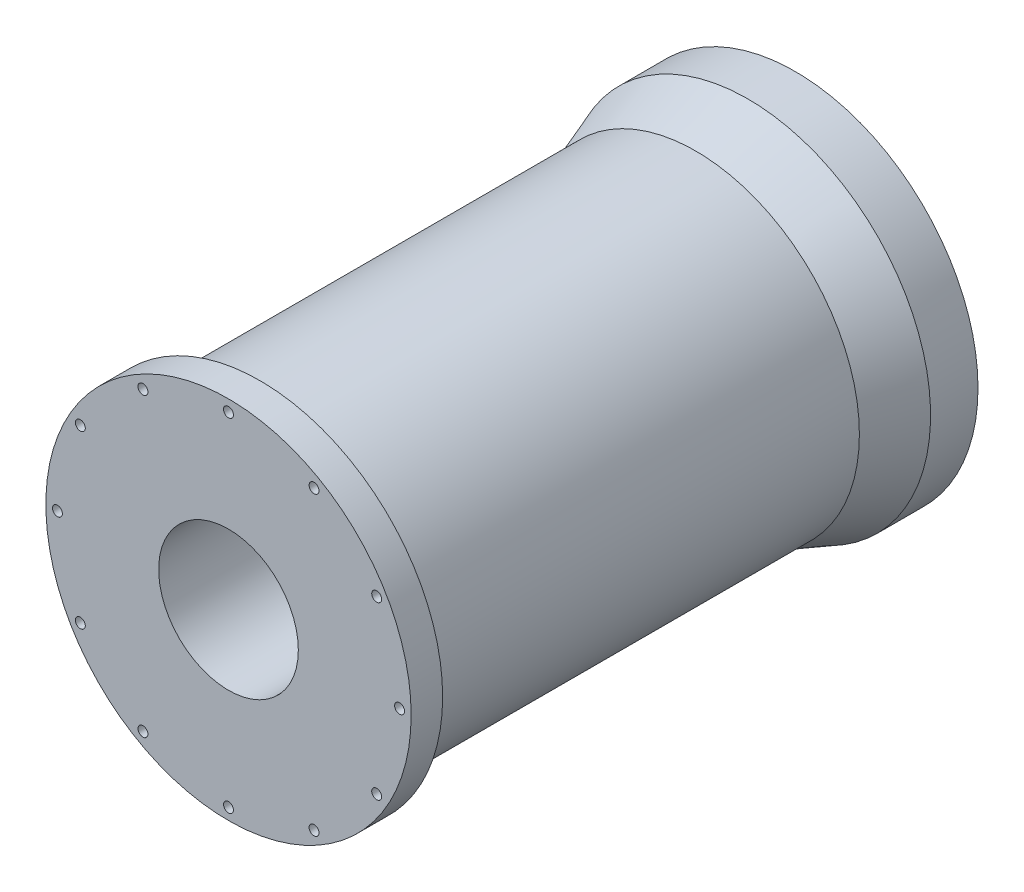
ISO-10303-21;
HEADER;
FILE_DESCRIPTION(('STEP AP214'),'2;1');
FILE_NAME('part.step','',(''),(''),'','','');
FILE_SCHEMA(('AUTOMOTIVE_DESIGN { 1 0 10303 214 1 1 1 1 }'));
ENDSEC;
DATA;
#1=APPLICATION_CONTEXT('core data for automotive mechanical design processes');
#2=APPLICATION_PROTOCOL_DEFINITION('international standard','automotive_design',2000,#1);
#3=PRODUCT_CONTEXT('',#1,'mechanical');
#4=PRODUCT('Part','Part','',(#3));
#5=PRODUCT_RELATED_PRODUCT_CATEGORY('part','',(#4));
#6=PRODUCT_DEFINITION_FORMATION('','',#4);
#7=PRODUCT_DEFINITION_CONTEXT('part definition',#1,'design');
#8=PRODUCT_DEFINITION('design','',#6,#7);
#9=PRODUCT_DEFINITION_SHAPE('','',#8);
#10=(LENGTH_UNIT() NAMED_UNIT(*) SI_UNIT(.MILLI.,.METRE.));
#11=(NAMED_UNIT(*) PLANE_ANGLE_UNIT() SI_UNIT($,.RADIAN.));
#12=(NAMED_UNIT(*) SI_UNIT($,.STERADIAN.) SOLID_ANGLE_UNIT());
#13=UNCERTAINTY_MEASURE_WITH_UNIT(LENGTH_MEASURE(1.E-05),#10,'distance_accuracy_value','');
#14=(GEOMETRIC_REPRESENTATION_CONTEXT(3) GLOBAL_UNCERTAINTY_ASSIGNED_CONTEXT((#13)) GLOBAL_UNIT_ASSIGNED_CONTEXT((#10,
#11,#12)) REPRESENTATION_CONTEXT('',''));
#15=CARTESIAN_POINT('',(0.,0.,0.));
#16=DIRECTION('',(0.,0.,1.));
#17=DIRECTION('',(1.,0.,0.));
#18=AXIS2_PLACEMENT_3D('',#15,#16,#17);
#19=CARTESIAN_POINT('',(0.,0.,12.7));
#20=DIRECTION('',(0.,0.,-1.));
#21=DIRECTION('',(-1.,0.,0.));
#22=AXIS2_PLACEMENT_3D('',#19,#20,#21);
#23=CYLINDRICAL_SURFACE('',#22,73.66);
#24=CARTESIAN_POINT('',(0.,0.,19.1290971615244));
#25=DIRECTION('',(0.,0.,-1.));
#26=DIRECTION('',(-1.,0.,0.));
#27=AXIS2_PLACEMENT_3D('',#24,#25,#26);
#28=CIRCLE('',#27,73.66);
#29=CARTESIAN_POINT('',(-73.66,0.,19.1290971615244));
#30=VERTEX_POINT('',#29);
#31=EDGE_CURVE('E10',#30,#30,#28,.T.);
#32=ORIENTED_EDGE('',*,*,#31,.T.);
#33=EDGE_LOOP('',(#32));
#34=FACE_BOUND('',#33,.T.);
#35=CARTESIAN_POINT('',(0.,0.,0.));
#36=DIRECTION('',(0.,0.,1.));
#37=DIRECTION('',(1.,0.,0.));
#38=AXIS2_PLACEMENT_3D('',#35,#36,#37);
#39=CIRCLE('',#38,73.66);
#40=CARTESIAN_POINT('',(73.66,0.,0.));
#41=VERTEX_POINT('',#40);
#42=EDGE_CURVE('E53',#41,#41,#39,.T.);
#43=ORIENTED_EDGE('',*,*,#42,.T.);
#44=EDGE_LOOP('',(#43));
#45=FACE_BOUND('',#44,.T.);
#46=ADVANCED_FACE('F39',(#34,#45),#23,.T.);
#47=CARTESIAN_POINT('',(0.,0.,0.));
#48=DIRECTION('',(0.,0.,1.));
#49=DIRECTION('',(1.,0.,0.));
#50=AXIS2_PLACEMENT_3D('',#47,#48,#49);
#51=PLANE('',#50);
#52=ORIENTED_EDGE('',*,*,#42,.F.);
#53=EDGE_LOOP('',(#52));
#54=FACE_BOUND('',#53,.T.);
#55=ADVANCED_FACE('F235',(#54),#51,.F.);
#56=CARTESIAN_POINT('',(0.,0.,215.9));
#57=DIRECTION('',(0.,0.,-1.));
#58=DIRECTION('',(-1.,0.,0.));
#59=AXIS2_PLACEMENT_3D('',#56,#57,#58);
#60=CYLINDRICAL_SURFACE('',#59,66.);
#61=CARTESIAN_POINT('',(0.,0.,40.1747741945471));
#62=DIRECTION('',(0.,0.,1.));
#63=DIRECTION('',(1.,0.,0.));
#64=AXIS2_PLACEMENT_3D('',#61,#62,#63);
#65=CIRCLE('',#64,66.);
#66=CARTESIAN_POINT('',(66.,0.,40.1747741945471));
#67=VERTEX_POINT('',#66);
#68=EDGE_CURVE('E48',#67,#67,#65,.T.);
#69=ORIENTED_EDGE('',*,*,#68,.T.);
#70=EDGE_LOOP('',(#69));
#71=FACE_BOUND('',#70,.T.);
#72=CARTESIAN_POINT('',(0.,0.,215.9));
#73=DIRECTION('',(0.,0.,1.));
#74=DIRECTION('',(1.,0.,0.));
#75=AXIS2_PLACEMENT_3D('',#72,#73,#74);
#76=CIRCLE('',#75,66.);
#77=CARTESIAN_POINT('',(66.,0.,215.9));
#78=VERTEX_POINT('',#77);
#79=EDGE_CURVE('E58',#78,#78,#76,.T.);
#80=ORIENTED_EDGE('',*,*,#79,.F.);
#81=EDGE_LOOP('',(#80));
#82=FACE_BOUND('',#81,.T.);
#83=ADVANCED_FACE('F219',(#71,#82),#60,.T.);
#84=CARTESIAN_POINT('',(0.,0.,228.6));
#85=DIRECTION('',(0.,0.,-1.));
#86=DIRECTION('',(-1.,0.,0.));
#87=AXIS2_PLACEMENT_3D('',#84,#85,#86);
#88=CYLINDRICAL_SURFACE('',#87,73.66);
#89=CARTESIAN_POINT('',(0.,0.,228.6));
#90=DIRECTION('',(0.,0.,1.));
#91=DIRECTION('',(1.,0.,0.));
#92=AXIS2_PLACEMENT_3D('',#89,#90,#91);
#93=CIRCLE('',#92,73.66);
#94=CARTESIAN_POINT('',(73.66,0.,228.6));
#95=VERTEX_POINT('',#94);
#96=EDGE_CURVE('E64',#95,#95,#93,.T.);
#97=ORIENTED_EDGE('',*,*,#96,.F.);
#98=EDGE_LOOP('',(#97));
#99=FACE_BOUND('',#98,.T.);
#100=CARTESIAN_POINT('',(0.,0.,215.9));
#101=DIRECTION('',(0.,0.,1.));
#102=DIRECTION('',(1.,0.,0.));
#103=AXIS2_PLACEMENT_3D('',#100,#101,#102);
#104=CIRCLE('',#103,73.66);
#105=CARTESIAN_POINT('',(73.66,0.,215.9));
#106=VERTEX_POINT('',#105);
#107=EDGE_CURVE('E65',#106,#106,#104,.T.);
#108=ORIENTED_EDGE('',*,*,#107,.T.);
#109=EDGE_LOOP('',(#108));
#110=FACE_BOUND('',#109,.T.);
#111=ADVANCED_FACE('F189',(#99,#110),#88,.T.);
#112=CARTESIAN_POINT('',(0.,0.,228.6));
#113=DIRECTION('',(0.,0.,1.));
#114=DIRECTION('',(1.,0.,0.));
#115=AXIS2_PLACEMENT_3D('',#112,#113,#114);
#116=PLANE('',#115);
#117=CARTESIAN_POINT('',(0.,0.,228.6));
#118=DIRECTION('',(0.,0.,1.));
#119=DIRECTION('',(1.,0.,0.));
#120=AXIS2_PLACEMENT_3D('',#117,#118,#119);
#121=CIRCLE('',#120,28.1625529);
#122=CARTESIAN_POINT('',(28.1625529,0.,228.6));
#123=VERTEX_POINT('',#122);
#124=EDGE_CURVE('E169',#123,#123,#121,.T.);
#125=ORIENTED_EDGE('',*,*,#124,.F.);
#126=EDGE_LOOP('',(#125));
#127=FACE_BOUND('',#126,.T.);
#128=CARTESIAN_POINT('',(0.,69.,228.6));
#129=DIRECTION('',(0.,0.,1.));
#130=DIRECTION('',(1.,0.,0.));
#131=AXIS2_PLACEMENT_3D('',#128,#129,#130);
#132=CIRCLE('',#131,2.);
#133=CARTESIAN_POINT('',(2.,69.,228.6));
#134=VERTEX_POINT('',#133);
#135=EDGE_CURVE('E106',#134,#134,#132,.T.);
#136=ORIENTED_EDGE('',*,*,#135,.F.);
#137=EDGE_LOOP('',(#136));
#138=FACE_BOUND('',#137,.T.);
#139=CARTESIAN_POINT('',(-34.4999999999992,59.7557528611233,228.6));
#140=DIRECTION('',(0.,0.,1.));
#141=DIRECTION('',(1.,0.,0.));
#142=AXIS2_PLACEMENT_3D('',#139,#140,#141);
#143=CIRCLE('',#142,2.);
#144=CARTESIAN_POINT('',(-32.4999999999992,59.7557528611233,228.6));
#145=VERTEX_POINT('',#144);
#146=EDGE_CURVE('E139',#145,#145,#143,.T.);
#147=ORIENTED_EDGE('',*,*,#146,.F.);
#148=EDGE_LOOP('',(#147));
#149=FACE_BOUND('',#148,.T.);
#150=CARTESIAN_POINT('',(-59.7557528611233,34.4999999999948,228.6));
#151=DIRECTION('',(0.,0.,1.));
#152=DIRECTION('',(1.,0.,0.));
#153=AXIS2_PLACEMENT_3D('',#150,#151,#152);
#154=CIRCLE('',#153,2.);
#155=CARTESIAN_POINT('',(-57.7557528611233,34.4999999999948,228.6));
#156=VERTEX_POINT('',#155);
#157=EDGE_CURVE('E148',#156,#156,#154,.T.);
#158=ORIENTED_EDGE('',*,*,#157,.F.);
#159=EDGE_LOOP('',(#158));
#160=FACE_BOUND('',#159,.T.);
#161=CARTESIAN_POINT('',(-68.9999999999941,-5.93746887267724E-12,228.6));
#162=DIRECTION('',(0.,0.,1.));
#163=DIRECTION('',(1.,0.,0.));
#164=AXIS2_PLACEMENT_3D('',#161,#162,#163);
#165=CIRCLE('',#164,2.);
#166=CARTESIAN_POINT('',(-66.9999999999941,-5.93746887267724E-12,228.6));
#167=VERTEX_POINT('',#166);
#168=EDGE_CURVE('E156',#167,#167,#165,.T.);
#169=ORIENTED_EDGE('',*,*,#168,.F.);
#170=EDGE_LOOP('',(#169));
#171=FACE_BOUND('',#170,.T.);
#172=CARTESIAN_POINT('',(34.5000000000008,59.7557528611292,228.6));
#173=DIRECTION('',(0.,0.,1.));
#174=DIRECTION('',(1.,0.,0.));
#175=AXIS2_PLACEMENT_3D('',#172,#173,#174);
#176=CIRCLE('',#175,2.);
#177=CARTESIAN_POINT('',(36.5000000000008,59.7557528611292,228.6));
#178=VERTEX_POINT('',#177);
#179=EDGE_CURVE('E98',#178,#178,#176,.T.);
#180=ORIENTED_EDGE('',*,*,#179,.F.);
#181=EDGE_LOOP('',(#180));
#182=FACE_BOUND('',#181,.T.);
#183=CARTESIAN_POINT('',(59.7557528611292,34.5000000000051,228.6));
#184=DIRECTION('',(0.,0.,1.));
#185=DIRECTION('',(1.,0.,0.));
#186=AXIS2_PLACEMENT_3D('',#183,#184,#185);
#187=CIRCLE('',#186,2.);
#188=CARTESIAN_POINT('',(61.7557528611292,34.5000000000051,228.6));
#189=VERTEX_POINT('',#188);
#190=EDGE_CURVE('E90',#189,#189,#187,.T.);
#191=ORIENTED_EDGE('',*,*,#190,.F.);
#192=EDGE_LOOP('',(#191));
#193=FACE_BOUND('',#192,.T.);
#194=CARTESIAN_POINT('',(69.0000000000059,5.92901880976312E-12,228.6));
#195=DIRECTION('',(0.,0.,1.));
#196=DIRECTION('',(1.,0.,0.));
#197=AXIS2_PLACEMENT_3D('',#194,#195,#196);
#198=CIRCLE('',#197,2.);
#199=CARTESIAN_POINT('',(71.0000000000059,5.92901880976312E-12,228.6));
#200=VERTEX_POINT('',#199);
#201=EDGE_CURVE('E82',#200,#200,#198,.T.);
#202=ORIENTED_EDGE('',*,*,#201,.F.);
#203=EDGE_LOOP('',(#202));
#204=FACE_BOUND('',#203,.T.);
#205=CARTESIAN_POINT('',(59.7557528611352,-34.4999999999949,228.6));
#206=DIRECTION('',(0.,0.,1.));
#207=DIRECTION('',(1.,0.,0.));
#208=AXIS2_PLACEMENT_3D('',#205,#206,#207);
#209=CIRCLE('',#208,2.);
#210=CARTESIAN_POINT('',(61.7557528611352,-34.4999999999949,228.6));
#211=VERTEX_POINT('',#210);
#212=EDGE_CURVE('E73',#211,#211,#209,.T.);
#213=ORIENTED_EDGE('',*,*,#212,.F.);
#214=EDGE_LOOP('',(#213));
#215=FACE_BOUND('',#214,.T.);
#216=CARTESIAN_POINT('',(34.5000000000111,-59.7557528611233,228.6));
#217=DIRECTION('',(0.,0.,1.));
#218=DIRECTION('',(1.,0.,0.));
#219=AXIS2_PLACEMENT_3D('',#216,#217,#218);
#220=CIRCLE('',#219,2.);
#221=CARTESIAN_POINT('',(36.5000000000111,-59.7557528611233,228.6));
#222=VERTEX_POINT('',#221);
#223=EDGE_CURVE('E132',#222,#222,#220,.T.);
#224=ORIENTED_EDGE('',*,*,#223,.F.);
#225=EDGE_LOOP('',(#224));
#226=FACE_BOUND('',#225,.T.);
#227=CARTESIAN_POINT('',(1.18580376195262E-11,-69.,228.6));
#228=DIRECTION('',(0.,0.,1.));
#229=DIRECTION('',(1.,0.,0.));
#230=AXIS2_PLACEMENT_3D('',#227,#228,#229);
#231=CIRCLE('',#230,2.);
#232=CARTESIAN_POINT('',(2.00000000001186,-69.,228.6));
#233=VERTEX_POINT('',#232);
#234=EDGE_CURVE('E124',#233,#233,#231,.T.);
#235=ORIENTED_EDGE('',*,*,#234,.F.);
#236=EDGE_LOOP('',(#235));
#237=FACE_BOUND('',#236,.T.);
#238=CARTESIAN_POINT('',(-34.4999999999889,-59.7557528611292,228.6));
#239=DIRECTION('',(0.,0.,1.));
#240=DIRECTION('',(1.,0.,0.));
#241=AXIS2_PLACEMENT_3D('',#238,#239,#240);
#242=CIRCLE('',#241,2.);
#243=CARTESIAN_POINT('',(-32.4999999999889,-59.7557528611292,228.6));
#244=VERTEX_POINT('',#243);
#245=EDGE_CURVE('E116',#244,#244,#242,.T.);
#246=ORIENTED_EDGE('',*,*,#245,.F.);
#247=EDGE_LOOP('',(#246));
#248=FACE_BOUND('',#247,.T.);
#249=CARTESIAN_POINT('',(-59.7557528611174,-34.5000000000052,228.6));
#250=DIRECTION('',(0.,0.,1.));
#251=DIRECTION('',(1.,0.,0.));
#252=AXIS2_PLACEMENT_3D('',#249,#250,#251);
#253=CIRCLE('',#252,2.);
#254=CARTESIAN_POINT('',(-57.7557528611174,-34.5000000000052,228.6));
#255=VERTEX_POINT('',#254);
#256=EDGE_CURVE('E107',#255,#255,#253,.T.);
#257=ORIENTED_EDGE('',*,*,#256,.F.);
#258=EDGE_LOOP('',(#257));
#259=FACE_BOUND('',#258,.T.);
#260=ORIENTED_EDGE('',*,*,#96,.T.);
#261=EDGE_LOOP('',(#260));
#262=FACE_BOUND('',#261,.T.);
#263=ADVANCED_FACE('F185',(#127,#138,#149,#160,#171,#182,#193,#204,#215,#226,#237,#248,#259,
#262),#116,.T.);
#264=CARTESIAN_POINT('',(0.,0.,215.9));
#265=DIRECTION('',(0.,0.,1.));
#266=DIRECTION('',(1.,0.,0.));
#267=AXIS2_PLACEMENT_3D('',#264,#265,#266);
#268=PLANE('',#267);
#269=CARTESIAN_POINT('',(0.,69.,215.9));
#270=DIRECTION('',(0.,0.,1.));
#271=DIRECTION('',(1.,0.,0.));
#272=AXIS2_PLACEMENT_3D('',#269,#270,#271);
#273=CIRCLE('',#272,2.);
#274=CARTESIAN_POINT('',(2.,69.,215.9));
#275=VERTEX_POINT('',#274);
#276=EDGE_CURVE('E69',#275,#275,#273,.T.);
#277=ORIENTED_EDGE('',*,*,#276,.T.);
#278=EDGE_LOOP('',(#277));
#279=FACE_BOUND('',#278,.T.);
#280=CARTESIAN_POINT('',(-34.4999999999992,59.7557528611233,215.9));
#281=DIRECTION('',(0.,0.,1.));
#282=DIRECTION('',(1.,0.,0.));
#283=AXIS2_PLACEMENT_3D('',#280,#281,#282);
#284=CIRCLE('',#283,2.);
#285=CARTESIAN_POINT('',(-32.4999999999992,59.7557528611233,215.9));
#286=VERTEX_POINT('',#285);
#287=EDGE_CURVE('E143',#286,#286,#284,.T.);
#288=ORIENTED_EDGE('',*,*,#287,.T.);
#289=EDGE_LOOP('',(#288));
#290=FACE_BOUND('',#289,.T.);
#291=CARTESIAN_POINT('',(-59.7557528611233,34.4999999999948,215.9));
#292=DIRECTION('',(0.,0.,1.));
#293=DIRECTION('',(1.,0.,0.));
#294=AXIS2_PLACEMENT_3D('',#291,#292,#293);
#295=CIRCLE('',#294,2.);
#296=CARTESIAN_POINT('',(-57.7557528611233,34.4999999999948,215.9));
#297=VERTEX_POINT('',#296);
#298=EDGE_CURVE('E152',#297,#297,#295,.T.);
#299=ORIENTED_EDGE('',*,*,#298,.T.);
#300=EDGE_LOOP('',(#299));
#301=FACE_BOUND('',#300,.T.);
#302=CARTESIAN_POINT('',(-68.9999999999941,-5.93746887267724E-12,215.9));
#303=DIRECTION('',(0.,0.,1.));
#304=DIRECTION('',(1.,0.,0.));
#305=AXIS2_PLACEMENT_3D('',#302,#303,#304);
#306=CIRCLE('',#305,2.);
#307=CARTESIAN_POINT('',(-66.9999999999941,-5.93746887267724E-12,215.9));
#308=VERTEX_POINT('',#307);
#309=EDGE_CURVE('E112',#308,#308,#306,.T.);
#310=ORIENTED_EDGE('',*,*,#309,.T.);
#311=EDGE_LOOP('',(#310));
#312=FACE_BOUND('',#311,.T.);
#313=CARTESIAN_POINT('',(34.5000000000008,59.7557528611292,215.9));
#314=DIRECTION('',(0.,0.,1.));
#315=DIRECTION('',(1.,0.,0.));
#316=AXIS2_PLACEMENT_3D('',#313,#314,#315);
#317=CIRCLE('',#316,2.);
#318=CARTESIAN_POINT('',(36.5000000000008,59.7557528611292,215.9));
#319=VERTEX_POINT('',#318);
#320=EDGE_CURVE('E102',#319,#319,#317,.T.);
#321=ORIENTED_EDGE('',*,*,#320,.T.);
#322=EDGE_LOOP('',(#321));
#323=FACE_BOUND('',#322,.T.);
#324=CARTESIAN_POINT('',(59.7557528611292,34.5000000000051,215.9));
#325=DIRECTION('',(0.,0.,1.));
#326=DIRECTION('',(1.,0.,0.));
#327=AXIS2_PLACEMENT_3D('',#324,#325,#326);
#328=CIRCLE('',#327,2.);
#329=CARTESIAN_POINT('',(61.7557528611292,34.5000000000051,215.9));
#330=VERTEX_POINT('',#329);
#331=EDGE_CURVE('E94',#330,#330,#328,.T.);
#332=ORIENTED_EDGE('',*,*,#331,.T.);
#333=EDGE_LOOP('',(#332));
#334=FACE_BOUND('',#333,.T.);
#335=CARTESIAN_POINT('',(69.0000000000059,5.92901880976312E-12,215.9));
#336=DIRECTION('',(0.,0.,1.));
#337=DIRECTION('',(1.,0.,0.));
#338=AXIS2_PLACEMENT_3D('',#335,#336,#337);
#339=CIRCLE('',#338,2.);
#340=CARTESIAN_POINT('',(71.0000000000059,5.92901880976312E-12,215.9));
#341=VERTEX_POINT('',#340);
#342=EDGE_CURVE('E86',#341,#341,#339,.T.);
#343=ORIENTED_EDGE('',*,*,#342,.T.);
#344=EDGE_LOOP('',(#343));
#345=FACE_BOUND('',#344,.T.);
#346=CARTESIAN_POINT('',(59.7557528611352,-34.4999999999949,215.9));
#347=DIRECTION('',(0.,0.,1.));
#348=DIRECTION('',(1.,0.,0.));
#349=AXIS2_PLACEMENT_3D('',#346,#347,#348);
#350=CIRCLE('',#349,2.);
#351=CARTESIAN_POINT('',(61.7557528611352,-34.4999999999949,215.9));
#352=VERTEX_POINT('',#351);
#353=EDGE_CURVE('E77',#352,#352,#350,.T.);
#354=ORIENTED_EDGE('',*,*,#353,.T.);
#355=EDGE_LOOP('',(#354));
#356=FACE_BOUND('',#355,.T.);
#357=CARTESIAN_POINT('',(34.5000000000111,-59.7557528611233,215.9));
#358=DIRECTION('',(0.,0.,1.));
#359=DIRECTION('',(1.,0.,0.));
#360=AXIS2_PLACEMENT_3D('',#357,#358,#359);
#361=CIRCLE('',#360,2.);
#362=CARTESIAN_POINT('',(36.5000000000111,-59.7557528611233,215.9));
#363=VERTEX_POINT('',#362);
#364=EDGE_CURVE('E78',#363,#363,#361,.T.);
#365=ORIENTED_EDGE('',*,*,#364,.T.);
#366=EDGE_LOOP('',(#365));
#367=FACE_BOUND('',#366,.T.);
#368=CARTESIAN_POINT('',(1.18580376195262E-11,-69.,215.9));
#369=DIRECTION('',(0.,0.,1.));
#370=DIRECTION('',(1.,0.,0.));
#371=AXIS2_PLACEMENT_3D('',#368,#369,#370);
#372=CIRCLE('',#371,2.);
#373=CARTESIAN_POINT('',(2.00000000001186,-69.,215.9));
#374=VERTEX_POINT('',#373);
#375=EDGE_CURVE('E128',#374,#374,#372,.T.);
#376=ORIENTED_EDGE('',*,*,#375,.T.);
#377=EDGE_LOOP('',(#376));
#378=FACE_BOUND('',#377,.T.);
#379=CARTESIAN_POINT('',(-34.4999999999889,-59.7557528611292,215.9));
#380=DIRECTION('',(0.,0.,1.));
#381=DIRECTION('',(1.,0.,0.));
#382=AXIS2_PLACEMENT_3D('',#379,#380,#381);
#383=CIRCLE('',#382,2.);
#384=CARTESIAN_POINT('',(-32.4999999999889,-59.7557528611292,215.9));
#385=VERTEX_POINT('',#384);
#386=EDGE_CURVE('E120',#385,#385,#383,.T.);
#387=ORIENTED_EDGE('',*,*,#386,.T.);
#388=EDGE_LOOP('',(#387));
#389=FACE_BOUND('',#388,.T.);
#390=CARTESIAN_POINT('',(-59.7557528611174,-34.5000000000052,215.9));
#391=DIRECTION('',(0.,0.,1.));
#392=DIRECTION('',(1.,0.,0.));
#393=AXIS2_PLACEMENT_3D('',#390,#391,#392);
#394=CIRCLE('',#393,2.);
#395=CARTESIAN_POINT('',(-57.7557528611174,-34.5000000000052,215.9));
#396=VERTEX_POINT('',#395);
#397=EDGE_CURVE('E111',#396,#396,#394,.T.);
#398=ORIENTED_EDGE('',*,*,#397,.T.);
#399=EDGE_LOOP('',(#398));
#400=FACE_BOUND('',#399,.T.);
#401=ORIENTED_EDGE('',*,*,#79,.T.);
#402=EDGE_LOOP('',(#401));
#403=FACE_BOUND('',#402,.T.);
#404=ORIENTED_EDGE('',*,*,#107,.F.);
#405=EDGE_LOOP('',(#404));
#406=FACE_BOUND('',#405,.T.);
#407=ADVANCED_FACE('F188',(#279,#290,#301,#312,#323,#334,#345,#356,#367,#378,#389,#400,#403,
#406),#268,.F.);
#408=CARTESIAN_POINT('',(-59.7557528611174,-34.5000000000052,215.9));
#409=DIRECTION('',(0.,0.,1.));
#410=DIRECTION('',(1.,0.,0.));
#411=AXIS2_PLACEMENT_3D('',#408,#409,#410);
#412=CYLINDRICAL_SURFACE('',#411,2.);
#413=ORIENTED_EDGE('',*,*,#397,.F.);
#414=EDGE_LOOP('',(#413));
#415=FACE_BOUND('',#414,.T.);
#416=ORIENTED_EDGE('',*,*,#256,.T.);
#417=EDGE_LOOP('',(#416));
#418=FACE_BOUND('',#417,.T.);
#419=ADVANCED_FACE('F224',(#415,#418),#412,.F.);
#420=CARTESIAN_POINT('',(-34.4999999999889,-59.7557528611292,215.9));
#421=DIRECTION('',(0.,0.,1.));
#422=DIRECTION('',(1.,0.,0.));
#423=AXIS2_PLACEMENT_3D('',#420,#421,#422);
#424=CYLINDRICAL_SURFACE('',#423,2.);
#425=ORIENTED_EDGE('',*,*,#386,.F.);
#426=EDGE_LOOP('',(#425));
#427=FACE_BOUND('',#426,.T.);
#428=ORIENTED_EDGE('',*,*,#245,.T.);
#429=EDGE_LOOP('',(#428));
#430=FACE_BOUND('',#429,.T.);
#431=ADVANCED_FACE('F230',(#427,#430),#424,.F.);
#432=CARTESIAN_POINT('',(1.18580376195262E-11,-69.,215.9));
#433=DIRECTION('',(0.,0.,1.));
#434=DIRECTION('',(1.,0.,0.));
#435=AXIS2_PLACEMENT_3D('',#432,#433,#434);
#436=CYLINDRICAL_SURFACE('',#435,2.);
#437=ORIENTED_EDGE('',*,*,#375,.F.);
#438=EDGE_LOOP('',(#437));
#439=FACE_BOUND('',#438,.T.);
#440=ORIENTED_EDGE('',*,*,#234,.T.);
#441=EDGE_LOOP('',(#440));
#442=FACE_BOUND('',#441,.T.);
#443=ADVANCED_FACE('F304',(#439,#442),#436,.F.);
#444=CARTESIAN_POINT('',(34.5000000000111,-59.7557528611233,215.9));
#445=DIRECTION('',(0.,0.,1.));
#446=DIRECTION('',(1.,0.,0.));
#447=AXIS2_PLACEMENT_3D('',#444,#445,#446);
#448=CYLINDRICAL_SURFACE('',#447,2.);
#449=ORIENTED_EDGE('',*,*,#364,.F.);
#450=EDGE_LOOP('',(#449));
#451=FACE_BOUND('',#450,.T.);
#452=ORIENTED_EDGE('',*,*,#223,.T.);
#453=EDGE_LOOP('',(#452));
#454=FACE_BOUND('',#453,.T.);
#455=ADVANCED_FACE('F300',(#451,#454),#448,.F.);
#456=CARTESIAN_POINT('',(59.7557528611352,-34.4999999999949,215.9));
#457=DIRECTION('',(0.,0.,1.));
#458=DIRECTION('',(1.,0.,0.));
#459=AXIS2_PLACEMENT_3D('',#456,#457,#458);
#460=CYLINDRICAL_SURFACE('',#459,2.);
#461=ORIENTED_EDGE('',*,*,#353,.F.);
#462=EDGE_LOOP('',(#461));
#463=FACE_BOUND('',#462,.T.);
#464=ORIENTED_EDGE('',*,*,#212,.T.);
#465=EDGE_LOOP('',(#464));
#466=FACE_BOUND('',#465,.T.);
#467=ADVANCED_FACE('F303',(#463,#466),#460,.F.);
#468=CARTESIAN_POINT('',(69.0000000000059,5.92901880976312E-12,215.9));
#469=DIRECTION('',(0.,0.,1.));
#470=DIRECTION('',(1.,0.,0.));
#471=AXIS2_PLACEMENT_3D('',#468,#469,#470);
#472=CYLINDRICAL_SURFACE('',#471,2.);
#473=ORIENTED_EDGE('',*,*,#342,.F.);
#474=EDGE_LOOP('',(#473));
#475=FACE_BOUND('',#474,.T.);
#476=ORIENTED_EDGE('',*,*,#201,.T.);
#477=EDGE_LOOP('',(#476));
#478=FACE_BOUND('',#477,.T.);
#479=ADVANCED_FACE('F318',(#475,#478),#472,.F.);
#480=CARTESIAN_POINT('',(59.7557528611292,34.5000000000051,215.9));
#481=DIRECTION('',(0.,0.,1.));
#482=DIRECTION('',(1.,0.,0.));
#483=AXIS2_PLACEMENT_3D('',#480,#481,#482);
#484=CYLINDRICAL_SURFACE('',#483,2.);
#485=ORIENTED_EDGE('',*,*,#331,.F.);
#486=EDGE_LOOP('',(#485));
#487=FACE_BOUND('',#486,.T.);
#488=ORIENTED_EDGE('',*,*,#190,.T.);
#489=EDGE_LOOP('',(#488));
#490=FACE_BOUND('',#489,.T.);
#491=ADVANCED_FACE('F314',(#487,#490),#484,.F.);
#492=CARTESIAN_POINT('',(34.5000000000008,59.7557528611292,215.9));
#493=DIRECTION('',(0.,0.,1.));
#494=DIRECTION('',(1.,0.,0.));
#495=AXIS2_PLACEMENT_3D('',#492,#493,#494);
#496=CYLINDRICAL_SURFACE('',#495,2.);
#497=ORIENTED_EDGE('',*,*,#320,.F.);
#498=EDGE_LOOP('',(#497));
#499=FACE_BOUND('',#498,.T.);
#500=ORIENTED_EDGE('',*,*,#179,.T.);
#501=EDGE_LOOP('',(#500));
#502=FACE_BOUND('',#501,.T.);
#503=ADVANCED_FACE('F292',(#499,#502),#496,.F.);
#504=CARTESIAN_POINT('',(-68.9999999999941,-5.93746887267724E-12,215.9));
#505=DIRECTION('',(0.,0.,1.));
#506=DIRECTION('',(1.,0.,0.));
#507=AXIS2_PLACEMENT_3D('',#504,#505,#506);
#508=CYLINDRICAL_SURFACE('',#507,2.);
#509=ORIENTED_EDGE('',*,*,#309,.F.);
#510=EDGE_LOOP('',(#509));
#511=FACE_BOUND('',#510,.T.);
#512=ORIENTED_EDGE('',*,*,#168,.T.);
#513=EDGE_LOOP('',(#512));
#514=FACE_BOUND('',#513,.T.);
#515=ADVANCED_FACE('F288',(#511,#514),#508,.F.);
#516=CARTESIAN_POINT('',(-59.7557528611233,34.4999999999948,215.9));
#517=DIRECTION('',(0.,0.,1.));
#518=DIRECTION('',(1.,0.,0.));
#519=AXIS2_PLACEMENT_3D('',#516,#517,#518);
#520=CYLINDRICAL_SURFACE('',#519,2.);
#521=ORIENTED_EDGE('',*,*,#298,.F.);
#522=EDGE_LOOP('',(#521));
#523=FACE_BOUND('',#522,.T.);
#524=ORIENTED_EDGE('',*,*,#157,.T.);
#525=EDGE_LOOP('',(#524));
#526=FACE_BOUND('',#525,.T.);
#527=ADVANCED_FACE('F291',(#523,#526),#520,.F.);
#528=CARTESIAN_POINT('',(-34.4999999999992,59.7557528611233,215.9));
#529=DIRECTION('',(0.,0.,1.));
#530=DIRECTION('',(1.,0.,0.));
#531=AXIS2_PLACEMENT_3D('',#528,#529,#530);
#532=CYLINDRICAL_SURFACE('',#531,2.);
#533=ORIENTED_EDGE('',*,*,#287,.F.);
#534=EDGE_LOOP('',(#533));
#535=FACE_BOUND('',#534,.T.);
#536=ORIENTED_EDGE('',*,*,#146,.T.);
#537=EDGE_LOOP('',(#536));
#538=FACE_BOUND('',#537,.T.);
#539=ADVANCED_FACE('F286',(#535,#538),#532,.F.);
#540=CARTESIAN_POINT('',(0.,69.,215.9));
#541=DIRECTION('',(0.,0.,1.));
#542=DIRECTION('',(1.,0.,0.));
#543=AXIS2_PLACEMENT_3D('',#540,#541,#542);
#544=CYLINDRICAL_SURFACE('',#543,2.);
#545=ORIENTED_EDGE('',*,*,#276,.F.);
#546=EDGE_LOOP('',(#545));
#547=FACE_BOUND('',#546,.T.);
#548=ORIENTED_EDGE('',*,*,#135,.T.);
#549=EDGE_LOOP('',(#548));
#550=FACE_BOUND('',#549,.T.);
#551=ADVANCED_FACE('F283',(#547,#550),#544,.F.);
#552=CARTESIAN_POINT('',(0.,0.,40.1747741945471));
#553=DIRECTION('',(0.,0.,-1.));
#554=DIRECTION('',(-1.,0.,0.));
#555=AXIS2_PLACEMENT_3D('',#552,#553,#554);
#556=CONICAL_SURFACE('',#555,66.,0.349065850398862);
#557=ORIENTED_EDGE('',*,*,#31,.F.);
#558=EDGE_LOOP('',(#557));
#559=FACE_BOUND('',#558,.T.);
#560=ORIENTED_EDGE('',*,*,#68,.F.);
#561=EDGE_LOOP('',(#560));
#562=FACE_BOUND('',#561,.T.);
#563=ADVANCED_FACE('F42',(#559,#562),#556,.T.);
#564=CARTESIAN_POINT('',(0.,0.,78.6));
#565=DIRECTION('',(0.,0.,1.));
#566=DIRECTION('',(1.,0.,0.));
#567=AXIS2_PLACEMENT_3D('',#564,#565,#566);
#568=CYLINDRICAL_SURFACE('',#567,28.1625529);
#569=CARTESIAN_POINT('',(0.,0.,78.6));
#570=DIRECTION('',(0.,0.,1.));
#571=DIRECTION('',(1.,0.,0.));
#572=AXIS2_PLACEMENT_3D('',#569,#570,#571);
#573=CIRCLE('',#572,28.1625529);
#574=CARTESIAN_POINT('',(28.1625529,0.,78.6));
#575=VERTEX_POINT('',#574);
#576=EDGE_CURVE('E144',#575,#575,#573,.T.);
#577=ORIENTED_EDGE('',*,*,#576,.F.);
#578=EDGE_LOOP('',(#577));
#579=FACE_BOUND('',#578,.T.);
#580=ORIENTED_EDGE('',*,*,#124,.T.);
#581=EDGE_LOOP('',(#580));
#582=FACE_BOUND('',#581,.T.);
#583=ADVANCED_FACE('F179',(#579,#582),#568,.F.);
#584=CARTESIAN_POINT('',(0.,0.,78.6));
#585=DIRECTION('',(0.,0.,1.));
#586=DIRECTION('',(1.,0.,0.));
#587=AXIS2_PLACEMENT_3D('',#584,#585,#586);
#588=PLANE('',#587);
#589=ORIENTED_EDGE('',*,*,#576,.T.);
#590=EDGE_LOOP('',(#589));
#591=FACE_BOUND('',#590,.T.);
#592=ADVANCED_FACE('F177',(#591),#588,.T.);
#593=CLOSED_SHELL('',(#46,#55,#83,#111,#263,#407,#419,#431,#443,#455,#467,#479,#491,#503,#515,
#527,#539,#551,#563,#583,#592));
#594=MANIFOLD_SOLID_BREP('B2',#593);
#595=ADVANCED_BREP_SHAPE_REPRESENTATION('',(#18,#594),#14);
#596=SHAPE_DEFINITION_REPRESENTATION(#9,#595);
ENDSEC;
END-ISO-10303-21;
